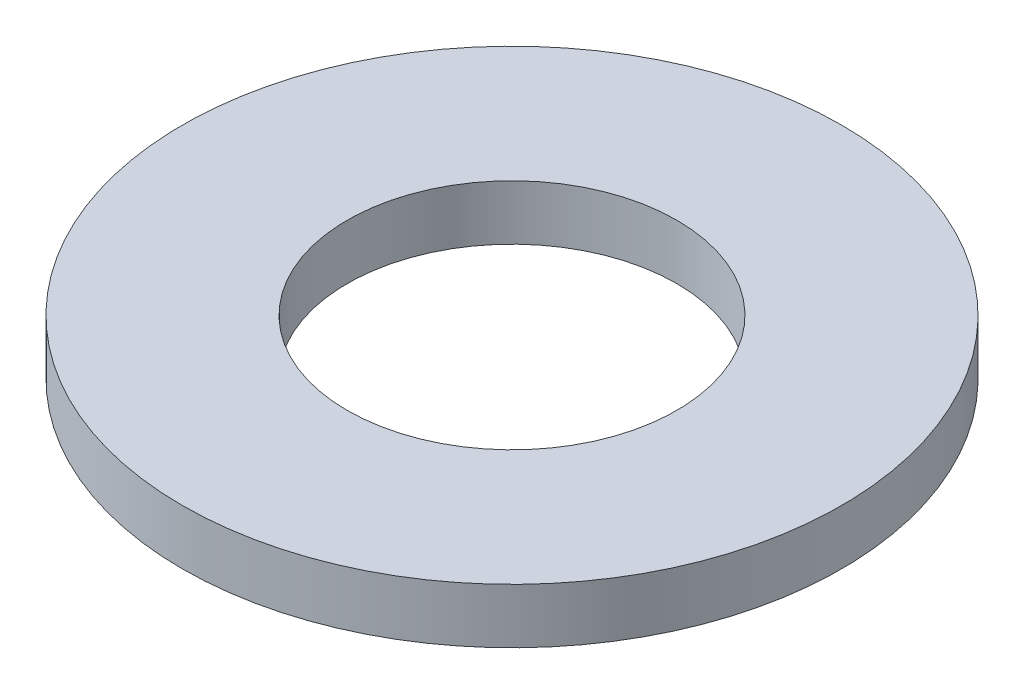
ISO-10303-21;
HEADER;
FILE_DESCRIPTION(('STEP AP214'),'2;1');
FILE_NAME('part.step','',(''),(''),'','','');
FILE_SCHEMA(('AUTOMOTIVE_DESIGN { 1 0 10303 214 1 1 1 1 }'));
ENDSEC;
DATA;
#1=APPLICATION_CONTEXT('core data for automotive mechanical design processes');
#2=APPLICATION_PROTOCOL_DEFINITION('international standard','automotive_design',2000,#1);
#3=PRODUCT_CONTEXT('',#1,'mechanical');
#4=PRODUCT('Part','Part','',(#3));
#5=PRODUCT_RELATED_PRODUCT_CATEGORY('part','',(#4));
#6=PRODUCT_DEFINITION_FORMATION('','',#4);
#7=PRODUCT_DEFINITION_CONTEXT('part definition',#1,'design');
#8=PRODUCT_DEFINITION('design','',#6,#7);
#9=PRODUCT_DEFINITION_SHAPE('','',#8);
#10=(LENGTH_UNIT() NAMED_UNIT(*) SI_UNIT(.MILLI.,.METRE.));
#11=(NAMED_UNIT(*) PLANE_ANGLE_UNIT() SI_UNIT($,.RADIAN.));
#12=(NAMED_UNIT(*) SI_UNIT($,.STERADIAN.) SOLID_ANGLE_UNIT());
#13=UNCERTAINTY_MEASURE_WITH_UNIT(LENGTH_MEASURE(1.E-05),#10,'distance_accuracy_value','');
#14=(GEOMETRIC_REPRESENTATION_CONTEXT(3) GLOBAL_UNCERTAINTY_ASSIGNED_CONTEXT((#13)) GLOBAL_UNIT_ASSIGNED_CONTEXT((#10,
#11,#12)) REPRESENTATION_CONTEXT('',''));
#15=CARTESIAN_POINT('',(0.,0.,0.));
#16=DIRECTION('',(0.,0.,1.));
#17=DIRECTION('',(1.,0.,0.));
#18=AXIS2_PLACEMENT_3D('',#15,#16,#17);
#19=CARTESIAN_POINT('',(0.,0.5,0.));
#20=DIRECTION('',(0.,1.,0.));
#21=DIRECTION('',(0.,0.,1.));
#22=AXIS2_PLACEMENT_3D('',#19,#20,#21);
#23=PLANE('',#22);
#24=CARTESIAN_POINT('',(0.,0.5,0.));
#25=DIRECTION('',(0.,1.,0.));
#26=DIRECTION('',(0.,0.,1.));
#27=AXIS2_PLACEMENT_3D('',#24,#25,#26);
#28=CIRCLE('',#27,3.);
#29=CARTESIAN_POINT('',(0.,0.5,3.));
#30=VERTEX_POINT('',#29);
#31=EDGE_CURVE('E10',#30,#30,#28,.T.);
#32=ORIENTED_EDGE('',*,*,#31,.T.);
#33=EDGE_LOOP('',(#32));
#34=FACE_BOUND('',#33,.T.);
#35=CARTESIAN_POINT('',(0.,0.5,0.));
#36=DIRECTION('',(0.,1.,0.));
#37=DIRECTION('',(0.,0.,1.));
#38=AXIS2_PLACEMENT_3D('',#35,#36,#37);
#39=CIRCLE('',#38,1.5);
#40=CARTESIAN_POINT('',(0.,0.5,1.5));
#41=VERTEX_POINT('',#40);
#42=EDGE_CURVE('E53',#41,#41,#39,.T.);
#43=ORIENTED_EDGE('',*,*,#42,.F.);
#44=EDGE_LOOP('',(#43));
#45=FACE_BOUND('',#44,.T.);
#46=ADVANCED_FACE('F40',(#34,#45),#23,.T.);
#47=CARTESIAN_POINT('',(0.,0.,0.));
#48=DIRECTION('',(0.,1.,0.));
#49=DIRECTION('',(0.,0.,1.));
#50=AXIS2_PLACEMENT_3D('',#47,#48,#49);
#51=PLANE('',#50);
#52=CARTESIAN_POINT('',(0.,0.,0.));
#53=DIRECTION('',(0.,1.,0.));
#54=DIRECTION('',(0.,0.,1.));
#55=AXIS2_PLACEMENT_3D('',#52,#53,#54);
#56=CIRCLE('',#55,3.);
#57=CARTESIAN_POINT('',(0.,0.,3.));
#58=VERTEX_POINT('',#57);
#59=EDGE_CURVE('E44',#58,#58,#56,.T.);
#60=ORIENTED_EDGE('',*,*,#59,.F.);
#61=EDGE_LOOP('',(#60));
#62=FACE_BOUND('',#61,.T.);
#63=CARTESIAN_POINT('',(0.,0.,0.));
#64=DIRECTION('',(0.,1.,0.));
#65=DIRECTION('',(0.,0.,1.));
#66=AXIS2_PLACEMENT_3D('',#63,#64,#65);
#67=CIRCLE('',#66,1.5);
#68=CARTESIAN_POINT('',(0.,0.,1.5));
#69=VERTEX_POINT('',#68);
#70=EDGE_CURVE('E55',#69,#69,#67,.T.);
#71=ORIENTED_EDGE('',*,*,#70,.T.);
#72=EDGE_LOOP('',(#71));
#73=FACE_BOUND('',#72,.T.);
#74=ADVANCED_FACE('F67',(#62,#73),#51,.F.);
#75=CARTESIAN_POINT('',(0.,0.5,0.));
#76=DIRECTION('',(0.,-1.,0.));
#77=DIRECTION('',(0.,0.,-1.));
#78=AXIS2_PLACEMENT_3D('',#75,#76,#77);
#79=CYLINDRICAL_SURFACE('',#78,3.);
#80=ORIENTED_EDGE('',*,*,#31,.F.);
#81=EDGE_LOOP('',(#80));
#82=FACE_BOUND('',#81,.T.);
#83=ORIENTED_EDGE('',*,*,#59,.T.);
#84=EDGE_LOOP('',(#83));
#85=FACE_BOUND('',#84,.T.);
#86=ADVANCED_FACE('F42',(#82,#85),#79,.T.);
#87=CARTESIAN_POINT('',(0.,0.5,0.));
#88=DIRECTION('',(0.,-1.,0.));
#89=DIRECTION('',(0.,0.,-1.));
#90=AXIS2_PLACEMENT_3D('',#87,#88,#89);
#91=CYLINDRICAL_SURFACE('',#90,1.5);
#92=ORIENTED_EDGE('',*,*,#42,.T.);
#93=EDGE_LOOP('',(#92));
#94=FACE_BOUND('',#93,.T.);
#95=ORIENTED_EDGE('',*,*,#70,.F.);
#96=EDGE_LOOP('',(#95));
#97=FACE_BOUND('',#96,.T.);
#98=ADVANCED_FACE('F63',(#94,#97),#91,.F.);
#99=CLOSED_SHELL('',(#46,#74,#86,#98));
#100=MANIFOLD_SOLID_BREP('B2',#99);
#101=ADVANCED_BREP_SHAPE_REPRESENTATION('',(#18,#100),#14);
#102=SHAPE_DEFINITION_REPRESENTATION(#9,#101);
ENDSEC;
END-ISO-10303-21;
